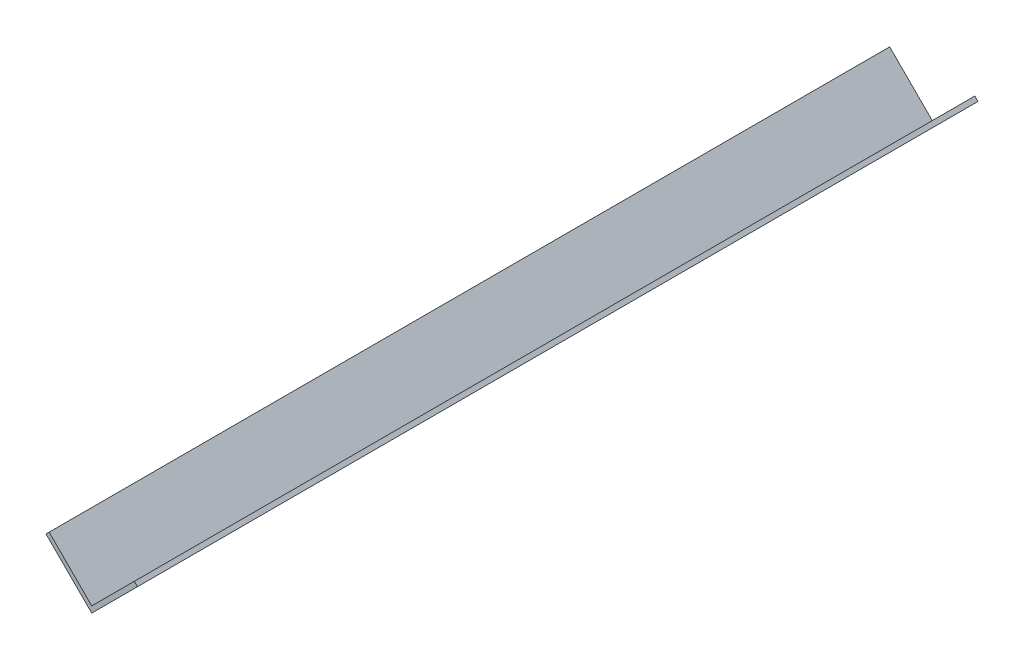
ISO-10303-21;
HEADER;
FILE_DESCRIPTION(('STEP AP214'),'2;1');
FILE_NAME('part.step','',(''),(''),'','','');
FILE_SCHEMA(('AUTOMOTIVE_DESIGN { 1 0 10303 214 1 1 1 1 }'));
ENDSEC;
DATA;
#1=APPLICATION_CONTEXT('core data for automotive mechanical design processes');
#2=APPLICATION_PROTOCOL_DEFINITION('international standard','automotive_design',2000,#1);
#3=PRODUCT_CONTEXT('',#1,'mechanical');
#4=PRODUCT('Part','Part','',(#3));
#5=PRODUCT_RELATED_PRODUCT_CATEGORY('part','',(#4));
#6=PRODUCT_DEFINITION_FORMATION('','',#4);
#7=PRODUCT_DEFINITION_CONTEXT('part definition',#1,'design');
#8=PRODUCT_DEFINITION('design','',#6,#7);
#9=PRODUCT_DEFINITION_SHAPE('','',#8);
#10=(LENGTH_UNIT() NAMED_UNIT(*) SI_UNIT(.MILLI.,.METRE.));
#11=(NAMED_UNIT(*) PLANE_ANGLE_UNIT() SI_UNIT($,.RADIAN.));
#12=(NAMED_UNIT(*) SI_UNIT($,.STERADIAN.) SOLID_ANGLE_UNIT());
#13=UNCERTAINTY_MEASURE_WITH_UNIT(LENGTH_MEASURE(1.E-05),#10,'distance_accuracy_value','');
#14=(GEOMETRIC_REPRESENTATION_CONTEXT(3) GLOBAL_UNCERTAINTY_ASSIGNED_CONTEXT((#13)) GLOBAL_UNIT_ASSIGNED_CONTEXT((#10,
#11,#12)) REPRESENTATION_CONTEXT('',''));
#15=CARTESIAN_POINT('',(0.,0.,0.));
#16=DIRECTION('',(0.,0.,1.));
#17=DIRECTION('',(1.,0.,0.));
#18=AXIS2_PLACEMENT_3D('',#15,#16,#17);
#19=CARTESIAN_POINT('',(17.9605122421383,17.9605122421383,330.2));
#20=DIRECTION('',(-0.707106781186547,0.707106781186548,0.));
#21=DIRECTION('',(-0.707106781186548,-0.707106781186547,0.));
#22=AXIS2_PLACEMENT_3D('',#19,#20,#21);
#23=PLANE('',#22);
#24=DIRECTION('',(0.707106781186548,0.707106781186547,0.));
#25=VECTOR('',#24,1.);
#26=CARTESIAN_POINT('',(17.9605122421383,17.9605122421383,0.));
#27=LINE('',#26,#25);
#28=CARTESIAN_POINT('',(0.,0.,0.));
#29=VERTEX_POINT('',#28);
#30=CARTESIAN_POINT('',(17.9605122421383,17.9605122421383,0.));
#31=VERTEX_POINT('',#30);
#32=EDGE_CURVE('E121',#29,#31,#27,.T.);
#33=ORIENTED_EDGE('',*,*,#32,.T.);
#34=DIRECTION('',(0.,0.,-1.));
#35=VECTOR('',#34,1.);
#36=CARTESIAN_POINT('',(17.9605122421383,17.9605122421383,330.2));
#37=LINE('',#36,#35);
#38=CARTESIAN_POINT('',(17.9605122421383,17.9605122421383,330.2));
#39=VERTEX_POINT('',#38);
#40=EDGE_CURVE('E11',#39,#31,#37,.T.);
#41=ORIENTED_EDGE('',*,*,#40,.F.);
#42=DIRECTION('',(0.707106781186548,0.707106781186547,0.));
#43=VECTOR('',#42,1.);
#44=CARTESIAN_POINT('',(17.9605122421383,17.9605122421383,330.2));
#45=LINE('',#44,#43);
#46=CARTESIAN_POINT('',(0.,0.,330.2));
#47=VERTEX_POINT('',#46);
#48=EDGE_CURVE('E131',#47,#39,#45,.T.);
#49=ORIENTED_EDGE('',*,*,#48,.F.);
#50=DIRECTION('',(0.,0.,-1.));
#51=VECTOR('',#50,1.);
#52=CARTESIAN_POINT('',(0.,0.,330.2));
#53=LINE('',#52,#51);
#54=EDGE_CURVE('E117',#47,#29,#53,.T.);
#55=ORIENTED_EDGE('',*,*,#54,.T.);
#56=EDGE_LOOP('',(#33,#41,#49,#55));
#57=FACE_BOUND('',#56,.T.);
#58=ADVANCED_FACE('F37',(#57),#23,.F.);
#59=CARTESIAN_POINT('',(16.7257270254913,19.1952974587853,330.2));
#60=DIRECTION('',(-0.707106781186546,-0.707106781186548,0.));
#61=DIRECTION('',(0.707106781186549,-0.707106781186547,0.));
#62=AXIS2_PLACEMENT_3D('',#59,#60,#61);
#63=PLANE('',#62);
#64=DIRECTION('',(-0.707106781186549,0.707106781186547,0.));
#65=VECTOR('',#64,1.);
#66=CARTESIAN_POINT('',(16.7257270254913,19.1952974587853,0.));
#67=LINE('',#66,#65);
#68=CARTESIAN_POINT('',(16.7257270254913,19.1952974587853,0.));
#69=VERTEX_POINT('',#68);
#70=EDGE_CURVE('E124',#31,#69,#67,.T.);
#71=ORIENTED_EDGE('',*,*,#70,.T.);
#72=DIRECTION('',(0.,0.,-1.));
#73=VECTOR('',#72,1.);
#74=CARTESIAN_POINT('',(16.7257270254913,19.1952974587853,330.2));
#75=LINE('',#74,#73);
#76=CARTESIAN_POINT('',(16.7257270254913,19.1952974587853,330.2));
#77=VERTEX_POINT('',#76);
#78=EDGE_CURVE('E45',#77,#69,#75,.T.);
#79=ORIENTED_EDGE('',*,*,#78,.F.);
#80=DIRECTION('',(-0.707106781186549,0.707106781186547,0.));
#81=VECTOR('',#80,1.);
#82=CARTESIAN_POINT('',(16.7257270254913,19.1952974587853,330.2));
#83=LINE('',#82,#81);
#84=EDGE_CURVE('E90',#39,#77,#83,.T.);
#85=ORIENTED_EDGE('',*,*,#84,.F.);
#86=ORIENTED_EDGE('',*,*,#40,.T.);
#87=EDGE_LOOP('',(#71,#79,#85,#86));
#88=FACE_BOUND('',#87,.T.);
#89=ADVANCED_FACE('F155',(#88),#63,.F.);
#90=CARTESIAN_POINT('',(0.,2.46957043329402,330.2));
#91=DIRECTION('',(0.707106781186547,-0.707106781186548,0.));
#92=DIRECTION('',(0.707106781186548,0.707106781186547,0.));
#93=AXIS2_PLACEMENT_3D('',#90,#91,#92);
#94=PLANE('',#93);
#95=DIRECTION('',(-0.707106781186548,-0.707106781186547,0.));
#96=VECTOR('',#95,1.);
#97=CARTESIAN_POINT('',(0.,2.46957043329402,0.));
#98=LINE('',#97,#96);
#99=CARTESIAN_POINT('',(0.,2.46957043329402,0.));
#100=VERTEX_POINT('',#99);
#101=EDGE_CURVE('E126',#69,#100,#98,.T.);
#102=ORIENTED_EDGE('',*,*,#101,.T.);
#103=DIRECTION('',(0.,0.,-1.));
#104=VECTOR('',#103,1.);
#105=CARTESIAN_POINT('',(0.,2.46957043329402,330.2));
#106=LINE('',#105,#104);
#107=CARTESIAN_POINT('',(0.,2.46957043329402,330.2));
#108=VERTEX_POINT('',#107);
#109=EDGE_CURVE('E112',#108,#100,#106,.T.);
#110=ORIENTED_EDGE('',*,*,#109,.F.);
#111=DIRECTION('',(-0.707106781186548,-0.707106781186547,0.));
#112=VECTOR('',#111,1.);
#113=CARTESIAN_POINT('',(0.,2.46957043329402,330.2));
#114=LINE('',#113,#112);
#115=EDGE_CURVE('E103',#77,#108,#114,.T.);
#116=ORIENTED_EDGE('',*,*,#115,.F.);
#117=ORIENTED_EDGE('',*,*,#78,.T.);
#118=EDGE_LOOP('',(#102,#110,#116,#117));
#119=FACE_BOUND('',#118,.T.);
#120=ADVANCED_FACE('F137',(#119),#94,.F.);
#121=CARTESIAN_POINT('',(-16.7257270254913,19.1952974587853,330.2));
#122=DIRECTION('',(-0.707106781186547,-0.707106781186548,0.));
#123=DIRECTION('',(0.707106781186548,-0.707106781186547,0.));
#124=AXIS2_PLACEMENT_3D('',#121,#122,#123);
#125=PLANE('',#124);
#126=DIRECTION('',(-0.707106781186548,0.707106781186547,0.));
#127=VECTOR('',#126,1.);
#128=CARTESIAN_POINT('',(-16.7257270254913,19.1952974587853,0.));
#129=LINE('',#128,#127);
#130=CARTESIAN_POINT('',(-16.7257270254913,19.1952974587853,0.));
#131=VERTEX_POINT('',#130);
#132=EDGE_CURVE('E111',#100,#131,#129,.T.);
#133=ORIENTED_EDGE('',*,*,#132,.T.);
#134=DIRECTION('',(0.,0.,-1.));
#135=VECTOR('',#134,1.);
#136=CARTESIAN_POINT('',(-16.7257270254913,19.1952974587853,330.2));
#137=LINE('',#136,#135);
#138=CARTESIAN_POINT('',(-16.7257270254913,19.1952974587853,330.2));
#139=VERTEX_POINT('',#138);
#140=EDGE_CURVE('E108',#139,#131,#137,.T.);
#141=ORIENTED_EDGE('',*,*,#140,.F.);
#142=DIRECTION('',(-0.707106781186548,0.707106781186547,0.));
#143=VECTOR('',#142,1.);
#144=CARTESIAN_POINT('',(-16.7257270254913,19.1952974587853,330.2));
#145=LINE('',#144,#143);
#146=EDGE_CURVE('E97',#108,#139,#145,.T.);
#147=ORIENTED_EDGE('',*,*,#146,.F.);
#148=ORIENTED_EDGE('',*,*,#109,.T.);
#149=EDGE_LOOP('',(#133,#141,#147,#148));
#150=FACE_BOUND('',#149,.T.);
#151=ADVANCED_FACE('F109',(#150),#125,.F.);
#152=CARTESIAN_POINT('',(-17.9605122421383,17.9605122421383,330.2));
#153=DIRECTION('',(0.707106781186547,-0.707106781186549,0.));
#154=DIRECTION('',(0.707106781186549,0.707106781186547,0.));
#155=AXIS2_PLACEMENT_3D('',#152,#153,#154);
#156=PLANE('',#155);
#157=DIRECTION('',(-0.707106781186548,-0.707106781186546,0.));
#158=VECTOR('',#157,1.);
#159=CARTESIAN_POINT('',(-17.9605122421383,17.9605122421383,0.));
#160=LINE('',#159,#158);
#161=CARTESIAN_POINT('',(-17.9605122421383,17.9605122421383,0.));
#162=VERTEX_POINT('',#161);
#163=EDGE_CURVE('E76',#131,#162,#160,.T.);
#164=ORIENTED_EDGE('',*,*,#163,.T.);
#165=DIRECTION('',(0.,0.,-1.));
#166=VECTOR('',#165,1.);
#167=CARTESIAN_POINT('',(-17.9605122421383,17.9605122421383,330.2));
#168=LINE('',#167,#166);
#169=CARTESIAN_POINT('',(-17.9605122421383,17.9605122421383,330.2));
#170=VERTEX_POINT('',#169);
#171=EDGE_CURVE('E113',#170,#162,#168,.T.);
#172=ORIENTED_EDGE('',*,*,#171,.F.);
#173=DIRECTION('',(-0.707106781186548,-0.707106781186546,0.));
#174=VECTOR('',#173,1.);
#175=CARTESIAN_POINT('',(-17.9605122421383,17.9605122421383,330.2));
#176=LINE('',#175,#174);
#177=EDGE_CURVE('E101',#139,#170,#176,.T.);
#178=ORIENTED_EDGE('',*,*,#177,.F.);
#179=ORIENTED_EDGE('',*,*,#140,.T.);
#180=EDGE_LOOP('',(#164,#172,#178,#179));
#181=FACE_BOUND('',#180,.T.);
#182=ADVANCED_FACE('F115',(#181),#156,.F.);
#183=CARTESIAN_POINT('',(0.,0.,330.2));
#184=DIRECTION('',(0.707106781186548,0.707106781186548,0.));
#185=DIRECTION('',(-0.707106781186548,0.707106781186548,0.));
#186=AXIS2_PLACEMENT_3D('',#183,#184,#185);
#187=PLANE('',#186);
#188=DIRECTION('',(0.707106781186548,-0.707106781186548,0.));
#189=VECTOR('',#188,1.);
#190=CARTESIAN_POINT('',(0.,0.,0.));
#191=LINE('',#190,#189);
#192=EDGE_CURVE('E82',#162,#29,#191,.T.);
#193=ORIENTED_EDGE('',*,*,#192,.T.);
#194=ORIENTED_EDGE('',*,*,#54,.F.);
#195=DIRECTION('',(0.707106781186548,-0.707106781186548,0.));
#196=VECTOR('',#195,1.);
#197=CARTESIAN_POINT('',(0.,0.,330.2));
#198=LINE('',#197,#196);
#199=EDGE_CURVE('E53',#170,#47,#198,.T.);
#200=ORIENTED_EDGE('',*,*,#199,.F.);
#201=ORIENTED_EDGE('',*,*,#171,.T.);
#202=EDGE_LOOP('',(#193,#194,#200,#201));
#203=FACE_BOUND('',#202,.T.);
#204=ADVANCED_FACE('F144',(#203),#187,.F.);
#205=CARTESIAN_POINT('',(0.,0.,330.2));
#206=DIRECTION('',(0.,0.,-1.));
#207=DIRECTION('',(-1.,0.,0.));
#208=AXIS2_PLACEMENT_3D('',#205,#206,#207);
#209=PLANE('',#208);
#210=ORIENTED_EDGE('',*,*,#48,.T.);
#211=ORIENTED_EDGE('',*,*,#84,.T.);
#212=ORIENTED_EDGE('',*,*,#115,.T.);
#213=ORIENTED_EDGE('',*,*,#146,.T.);
#214=ORIENTED_EDGE('',*,*,#177,.T.);
#215=ORIENTED_EDGE('',*,*,#199,.T.);
#216=EDGE_LOOP('',(#210,#211,#212,#213,#214,#215));
#217=FACE_BOUND('',#216,.T.);
#218=ADVANCED_FACE('F99',(#217),#209,.F.);
#219=CARTESIAN_POINT('',(0.,0.,0.));
#220=DIRECTION('',(0.,0.,-1.));
#221=DIRECTION('',(-1.,0.,0.));
#222=AXIS2_PLACEMENT_3D('',#219,#220,#221);
#223=PLANE('',#222);
#224=ORIENTED_EDGE('',*,*,#32,.F.);
#225=ORIENTED_EDGE('',*,*,#192,.F.);
#226=ORIENTED_EDGE('',*,*,#163,.F.);
#227=ORIENTED_EDGE('',*,*,#132,.F.);
#228=ORIENTED_EDGE('',*,*,#101,.F.);
#229=ORIENTED_EDGE('',*,*,#70,.F.);
#230=EDGE_LOOP('',(#224,#225,#226,#227,#228,#229));
#231=FACE_BOUND('',#230,.T.);
#232=ADVANCED_FACE('F140',(#231),#223,.T.);
#233=CLOSED_SHELL('',(#58,#89,#120,#151,#182,#204,#218,#232));
#234=MANIFOLD_SOLID_BREP('B2',#233);
#235=ADVANCED_BREP_SHAPE_REPRESENTATION('',(#18,#234),#14);
#236=SHAPE_DEFINITION_REPRESENTATION(#9,#235);
ENDSEC;
END-ISO-10303-21;
